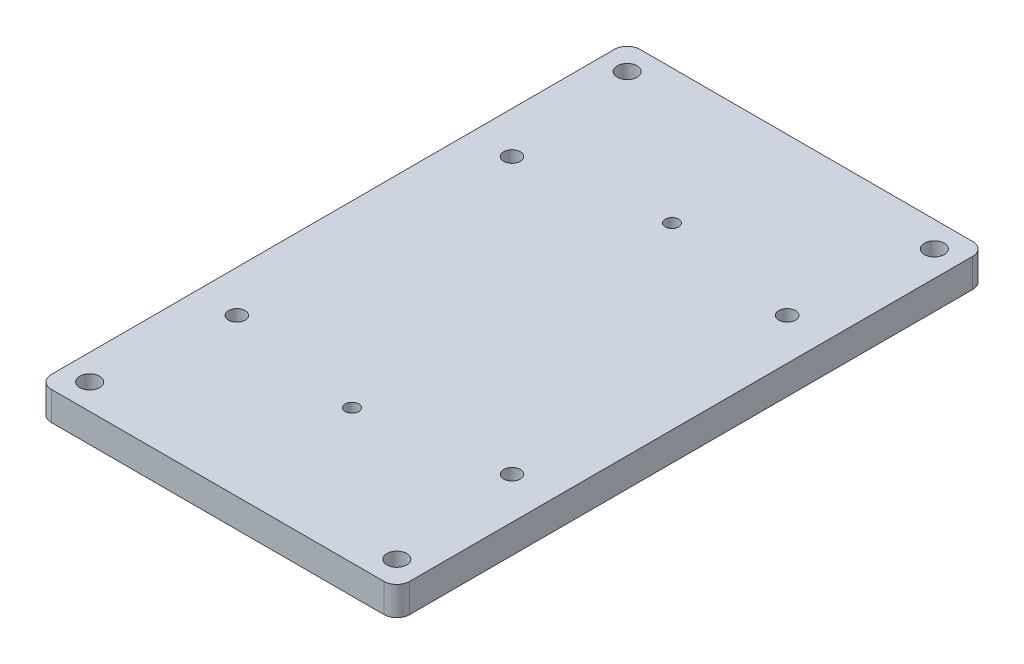
ISO-10303-21;
HEADER;
FILE_DESCRIPTION(('STEP AP214'),'2;1');
FILE_NAME('part.step','',(''),(''),'','','');
FILE_SCHEMA(('AUTOMOTIVE_DESIGN { 1 0 10303 214 1 1 1 1 }'));
ENDSEC;
DATA;
#1=APPLICATION_CONTEXT('core data for automotive mechanical design processes');
#2=APPLICATION_PROTOCOL_DEFINITION('international standard','automotive_design',2000,#1);
#3=PRODUCT_CONTEXT('',#1,'mechanical');
#4=PRODUCT('Part','Part','',(#3));
#5=PRODUCT_RELATED_PRODUCT_CATEGORY('part','',(#4));
#6=PRODUCT_DEFINITION_FORMATION('','',#4);
#7=PRODUCT_DEFINITION_CONTEXT('part definition',#1,'design');
#8=PRODUCT_DEFINITION('design','',#6,#7);
#9=PRODUCT_DEFINITION_SHAPE('','',#8);
#10=(LENGTH_UNIT() NAMED_UNIT(*) SI_UNIT(.MILLI.,.METRE.));
#11=(NAMED_UNIT(*) PLANE_ANGLE_UNIT() SI_UNIT($,.RADIAN.));
#12=(NAMED_UNIT(*) SI_UNIT($,.STERADIAN.) SOLID_ANGLE_UNIT());
#13=UNCERTAINTY_MEASURE_WITH_UNIT(LENGTH_MEASURE(1.E-05),#10,'distance_accuracy_value','');
#14=(GEOMETRIC_REPRESENTATION_CONTEXT(3) GLOBAL_UNCERTAINTY_ASSIGNED_CONTEXT((#13)) GLOBAL_UNIT_ASSIGNED_CONTEXT((#10,
#11,#12)) REPRESENTATION_CONTEXT('',''));
#15=CARTESIAN_POINT('',(0.,0.,0.));
#16=DIRECTION('',(0.,0.,1.));
#17=DIRECTION('',(1.,0.,0.));
#18=AXIS2_PLACEMENT_3D('',#15,#16,#17);
#19=CARTESIAN_POINT('',(26.,4.5,-44.));
#20=DIRECTION('',(0.,1.,0.));
#21=DIRECTION('',(0.,0.,1.));
#22=AXIS2_PLACEMENT_3D('',#19,#20,#21);
#23=PLANE('',#22);
#24=CARTESIAN_POINT('',(0.,4.5,-25.));
#25=DIRECTION('',(0.,1.,0.));
#26=DIRECTION('',(0.,0.,1.));
#27=AXIS2_PLACEMENT_3D('',#24,#25,#26);
#28=CIRCLE('',#27,1.05);
#29=CARTESIAN_POINT('',(0.,4.5,-23.95));
#30=VERTEX_POINT('',#29);
#31=EDGE_CURVE('E225',#30,#30,#28,.T.);
#32=ORIENTED_EDGE('',*,*,#31,.F.);
#33=EDGE_LOOP('',(#32));
#34=FACE_BOUND('',#33,.T.);
#35=CARTESIAN_POINT('',(21.5,4.5,21.5));
#36=DIRECTION('',(0.,1.,0.));
#37=DIRECTION('',(0.,0.,1.));
#38=AXIS2_PLACEMENT_3D('',#35,#36,#37);
#39=CIRCLE('',#38,1.3);
#40=CARTESIAN_POINT('',(21.5,4.5,22.8));
#41=VERTEX_POINT('',#40);
#42=EDGE_CURVE('E213',#41,#41,#39,.T.);
#43=ORIENTED_EDGE('',*,*,#42,.F.);
#44=EDGE_LOOP('',(#43));
#45=FACE_BOUND('',#44,.T.);
#46=CARTESIAN_POINT('',(-21.5,4.5,-21.5));
#47=DIRECTION('',(0.,1.,0.));
#48=DIRECTION('',(0.,0.,1.));
#49=AXIS2_PLACEMENT_3D('',#46,#47,#48);
#50=CIRCLE('',#49,1.3);
#51=CARTESIAN_POINT('',(-21.5,4.5,-20.2));
#52=VERTEX_POINT('',#51);
#53=EDGE_CURVE('E201',#52,#52,#50,.T.);
#54=ORIENTED_EDGE('',*,*,#53,.F.);
#55=EDGE_LOOP('',(#54));
#56=FACE_BOUND('',#55,.T.);
#57=CARTESIAN_POINT('',(-24.,4.5,-42.));
#58=DIRECTION('',(0.,1.,0.));
#59=DIRECTION('',(0.,0.,-1.));
#60=AXIS2_PLACEMENT_3D('',#57,#58,#59);
#61=CIRCLE('',#60,1.55);
#62=CARTESIAN_POINT('',(-24.,4.5,-43.55));
#63=VERTEX_POINT('',#62);
#64=EDGE_CURVE('E189',#63,#63,#61,.T.);
#65=ORIENTED_EDGE('',*,*,#64,.F.);
#66=EDGE_LOOP('',(#65));
#67=FACE_BOUND('',#66,.T.);
#68=CARTESIAN_POINT('',(24.,4.5,-42.));
#69=DIRECTION('',(0.,1.,0.));
#70=DIRECTION('',(0.,0.,1.));
#71=AXIS2_PLACEMENT_3D('',#68,#69,#70);
#72=CIRCLE('',#71,1.55);
#73=CARTESIAN_POINT('',(24.,4.5,-40.45));
#74=VERTEX_POINT('',#73);
#75=EDGE_CURVE('E135',#74,#74,#72,.T.);
#76=ORIENTED_EDGE('',*,*,#75,.F.);
#77=EDGE_LOOP('',(#76));
#78=FACE_BOUND('',#77,.T.);
#79=CARTESIAN_POINT('',(26.,4.5,-44.));
#80=DIRECTION('',(0.,1.,0.));
#81=DIRECTION('',(0.,0.,1.));
#82=AXIS2_PLACEMENT_3D('',#79,#80,#81);
#83=CIRCLE('',#82,1.99999999999999);
#84=CARTESIAN_POINT('',(28.,4.5,-44.));
#85=VERTEX_POINT('',#84);
#86=CARTESIAN_POINT('',(26.,4.5,-46.));
#87=VERTEX_POINT('',#86);
#88=EDGE_CURVE('E146',#85,#87,#83,.T.);
#89=ORIENTED_EDGE('',*,*,#88,.T.);
#90=DIRECTION('',(-1.,0.,0.));
#91=VECTOR('',#90,1.);
#92=CARTESIAN_POINT('',(-26.,4.5,-46.));
#93=LINE('',#92,#91);
#94=CARTESIAN_POINT('',(-26.,4.5,-46.));
#95=VERTEX_POINT('',#94);
#96=EDGE_CURVE('E94',#87,#95,#93,.T.);
#97=ORIENTED_EDGE('',*,*,#96,.T.);
#98=CARTESIAN_POINT('',(-26.,4.5,-44.));
#99=DIRECTION('',(0.,1.,0.));
#100=DIRECTION('',(0.,0.,-1.));
#101=AXIS2_PLACEMENT_3D('',#98,#99,#100);
#102=CIRCLE('',#101,1.99999999999999);
#103=CARTESIAN_POINT('',(-28.,4.5,-44.));
#104=VERTEX_POINT('',#103);
#105=EDGE_CURVE('E161',#95,#104,#102,.T.);
#106=ORIENTED_EDGE('',*,*,#105,.T.);
#107=DIRECTION('',(0.,0.,1.));
#108=VECTOR('',#107,1.);
#109=CARTESIAN_POINT('',(-28.,4.5,44.));
#110=LINE('',#109,#108);
#111=CARTESIAN_POINT('',(-28.,4.5,44.));
#112=VERTEX_POINT('',#111);
#113=EDGE_CURVE('E174',#104,#112,#110,.T.);
#114=ORIENTED_EDGE('',*,*,#113,.T.);
#115=CARTESIAN_POINT('',(-26.,4.5,44.));
#116=DIRECTION('',(0.,1.,0.));
#117=DIRECTION('',(0.,0.,1.));
#118=AXIS2_PLACEMENT_3D('',#115,#116,#117);
#119=CIRCLE('',#118,1.99999999999999);
#120=CARTESIAN_POINT('',(-26.,4.5,46.));
#121=VERTEX_POINT('',#120);
#122=EDGE_CURVE('E113',#112,#121,#119,.T.);
#123=ORIENTED_EDGE('',*,*,#122,.T.);
#124=DIRECTION('',(1.,0.,0.));
#125=VECTOR('',#124,1.);
#126=CARTESIAN_POINT('',(-26.,4.5,46.));
#127=LINE('',#126,#125);
#128=CARTESIAN_POINT('',(26.,4.5,46.));
#129=VERTEX_POINT('',#128);
#130=EDGE_CURVE('E107',#121,#129,#127,.T.);
#131=ORIENTED_EDGE('',*,*,#130,.T.);
#132=CARTESIAN_POINT('',(26.,4.5,44.));
#133=DIRECTION('',(0.,1.,0.));
#134=DIRECTION('',(0.,0.,1.));
#135=AXIS2_PLACEMENT_3D('',#132,#133,#134);
#136=CIRCLE('',#135,1.99999999999999);
#137=CARTESIAN_POINT('',(28.,4.5,44.));
#138=VERTEX_POINT('',#137);
#139=EDGE_CURVE('E111',#129,#138,#136,.T.);
#140=ORIENTED_EDGE('',*,*,#139,.T.);
#141=DIRECTION('',(0.,0.,-1.));
#142=VECTOR('',#141,1.);
#143=CARTESIAN_POINT('',(28.,4.5,44.));
#144=LINE('',#143,#142);
#145=EDGE_CURVE('E51',#138,#85,#144,.T.);
#146=ORIENTED_EDGE('',*,*,#145,.T.);
#147=EDGE_LOOP('',(#89,#97,#106,#114,#123,#131,#140,#146));
#148=FACE_BOUND('',#147,.T.);
#149=CARTESIAN_POINT('',(24.,4.5,42.));
#150=DIRECTION('',(0.,1.,0.));
#151=DIRECTION('',(0.,0.,-1.));
#152=AXIS2_PLACEMENT_3D('',#149,#150,#151);
#153=CIRCLE('',#152,1.55);
#154=CARTESIAN_POINT('',(24.,4.5,40.45));
#155=VERTEX_POINT('',#154);
#156=EDGE_CURVE('E183',#155,#155,#153,.T.);
#157=ORIENTED_EDGE('',*,*,#156,.F.);
#158=EDGE_LOOP('',(#157));
#159=FACE_BOUND('',#158,.T.);
#160=CARTESIAN_POINT('',(-24.,4.5,42.));
#161=DIRECTION('',(0.,1.,0.));
#162=DIRECTION('',(0.,0.,1.));
#163=AXIS2_PLACEMENT_3D('',#160,#161,#162);
#164=CIRCLE('',#163,1.55);
#165=CARTESIAN_POINT('',(-24.,4.5,43.55));
#166=VERTEX_POINT('',#165);
#167=EDGE_CURVE('E195',#166,#166,#164,.T.);
#168=ORIENTED_EDGE('',*,*,#167,.F.);
#169=EDGE_LOOP('',(#168));
#170=FACE_BOUND('',#169,.T.);
#171=CARTESIAN_POINT('',(21.5,4.5,-21.5));
#172=DIRECTION('',(0.,1.,0.));
#173=DIRECTION('',(0.,0.,-1.));
#174=AXIS2_PLACEMENT_3D('',#171,#172,#173);
#175=CIRCLE('',#174,1.3);
#176=CARTESIAN_POINT('',(21.5,4.5,-22.8));
#177=VERTEX_POINT('',#176);
#178=EDGE_CURVE('E207',#177,#177,#175,.T.);
#179=ORIENTED_EDGE('',*,*,#178,.F.);
#180=EDGE_LOOP('',(#179));
#181=FACE_BOUND('',#180,.T.);
#182=CARTESIAN_POINT('',(-21.5,4.5,21.5));
#183=DIRECTION('',(0.,1.,0.));
#184=DIRECTION('',(0.,0.,-1.));
#185=AXIS2_PLACEMENT_3D('',#182,#183,#184);
#186=CIRCLE('',#185,1.3);
#187=CARTESIAN_POINT('',(-21.5,4.5,20.2));
#188=VERTEX_POINT('',#187);
#189=EDGE_CURVE('E219',#188,#188,#186,.T.);
#190=ORIENTED_EDGE('',*,*,#189,.F.);
#191=EDGE_LOOP('',(#190));
#192=FACE_BOUND('',#191,.T.);
#193=CARTESIAN_POINT('',(0.,4.5,25.));
#194=DIRECTION('',(0.,1.,0.));
#195=DIRECTION('',(0.,0.,-1.));
#196=AXIS2_PLACEMENT_3D('',#193,#194,#195);
#197=CIRCLE('',#196,1.05);
#198=CARTESIAN_POINT('',(0.,4.5,23.95));
#199=VERTEX_POINT('',#198);
#200=EDGE_CURVE('E231',#199,#199,#197,.T.);
#201=ORIENTED_EDGE('',*,*,#200,.F.);
#202=EDGE_LOOP('',(#201));
#203=FACE_BOUND('',#202,.T.);
#204=ADVANCED_FACE('F34',(#34,#45,#56,#67,#78,#148,#159,#170,#181,#192,#203),#23,.T.);
#205=CARTESIAN_POINT('',(26.,0.,-44.));
#206=DIRECTION('',(0.,1.,0.));
#207=DIRECTION('',(0.,0.,1.));
#208=AXIS2_PLACEMENT_3D('',#205,#206,#207);
#209=PLANE('',#208);
#210=CARTESIAN_POINT('',(26.,0.,-44.));
#211=DIRECTION('',(0.,1.,0.));
#212=DIRECTION('',(0.,0.,1.));
#213=AXIS2_PLACEMENT_3D('',#210,#211,#212);
#214=CIRCLE('',#213,1.99999999999999);
#215=CARTESIAN_POINT('',(28.,0.,-44.));
#216=VERTEX_POINT('',#215);
#217=CARTESIAN_POINT('',(26.,0.,-46.));
#218=VERTEX_POINT('',#217);
#219=EDGE_CURVE('E131',#216,#218,#214,.T.);
#220=ORIENTED_EDGE('',*,*,#219,.F.);
#221=DIRECTION('',(0.,0.,-1.));
#222=VECTOR('',#221,1.);
#223=CARTESIAN_POINT('',(28.,0.,44.));
#224=LINE('',#223,#222);
#225=CARTESIAN_POINT('',(28.,0.,44.));
#226=VERTEX_POINT('',#225);
#227=EDGE_CURVE('E86',#226,#216,#224,.T.);
#228=ORIENTED_EDGE('',*,*,#227,.F.);
#229=CARTESIAN_POINT('',(26.,0.,44.));
#230=DIRECTION('',(0.,1.,0.));
#231=DIRECTION('',(0.,0.,1.));
#232=AXIS2_PLACEMENT_3D('',#229,#230,#231);
#233=CIRCLE('',#232,1.99999999999999);
#234=CARTESIAN_POINT('',(26.,0.,46.));
#235=VERTEX_POINT('',#234);
#236=EDGE_CURVE('E80',#235,#226,#233,.T.);
#237=ORIENTED_EDGE('',*,*,#236,.F.);
#238=DIRECTION('',(1.,0.,0.));
#239=VECTOR('',#238,1.);
#240=CARTESIAN_POINT('',(-26.,0.,46.));
#241=LINE('',#240,#239);
#242=CARTESIAN_POINT('',(-26.,0.,46.));
#243=VERTEX_POINT('',#242);
#244=EDGE_CURVE('E121',#243,#235,#241,.T.);
#245=ORIENTED_EDGE('',*,*,#244,.F.);
#246=CARTESIAN_POINT('',(-26.,0.,44.));
#247=DIRECTION('',(0.,1.,0.));
#248=DIRECTION('',(0.,0.,1.));
#249=AXIS2_PLACEMENT_3D('',#246,#247,#248);
#250=CIRCLE('',#249,1.99999999999999);
#251=CARTESIAN_POINT('',(-28.,0.,44.));
#252=VERTEX_POINT('',#251);
#253=EDGE_CURVE('E141',#252,#243,#250,.T.);
#254=ORIENTED_EDGE('',*,*,#253,.F.);
#255=DIRECTION('',(0.,0.,1.));
#256=VECTOR('',#255,1.);
#257=CARTESIAN_POINT('',(-28.,0.,44.));
#258=LINE('',#257,#256);
#259=CARTESIAN_POINT('',(-28.,0.,-44.));
#260=VERTEX_POINT('',#259);
#261=EDGE_CURVE('E139',#260,#252,#258,.T.);
#262=ORIENTED_EDGE('',*,*,#261,.F.);
#263=CARTESIAN_POINT('',(-26.,0.,-44.));
#264=DIRECTION('',(0.,1.,0.));
#265=DIRECTION('',(0.,0.,-1.));
#266=AXIS2_PLACEMENT_3D('',#263,#264,#265);
#267=CIRCLE('',#266,1.99999999999999);
#268=CARTESIAN_POINT('',(-26.,0.,-46.));
#269=VERTEX_POINT('',#268);
#270=EDGE_CURVE('E137',#269,#260,#267,.T.);
#271=ORIENTED_EDGE('',*,*,#270,.F.);
#272=DIRECTION('',(-1.,0.,0.));
#273=VECTOR('',#272,1.);
#274=CARTESIAN_POINT('',(-26.,0.,-46.));
#275=LINE('',#274,#273);
#276=EDGE_CURVE('E134',#218,#269,#275,.T.);
#277=ORIENTED_EDGE('',*,*,#276,.F.);
#278=EDGE_LOOP('',(#220,#228,#237,#245,#254,#262,#271,#277));
#279=FACE_BOUND('',#278,.T.);
#280=CARTESIAN_POINT('',(24.,0.,-42.));
#281=DIRECTION('',(0.,1.,0.));
#282=DIRECTION('',(0.,0.,1.));
#283=AXIS2_PLACEMENT_3D('',#280,#281,#282);
#284=CIRCLE('',#283,1.55);
#285=CARTESIAN_POINT('',(24.,0.,-40.45));
#286=VERTEX_POINT('',#285);
#287=EDGE_CURVE('E180',#286,#286,#284,.T.);
#288=ORIENTED_EDGE('',*,*,#287,.T.);
#289=EDGE_LOOP('',(#288));
#290=FACE_BOUND('',#289,.T.);
#291=CARTESIAN_POINT('',(24.,0.,42.));
#292=DIRECTION('',(0.,1.,0.));
#293=DIRECTION('',(0.,0.,-1.));
#294=AXIS2_PLACEMENT_3D('',#291,#292,#293);
#295=CIRCLE('',#294,1.55);
#296=CARTESIAN_POINT('',(24.,0.,40.45));
#297=VERTEX_POINT('',#296);
#298=EDGE_CURVE('E186',#297,#297,#295,.T.);
#299=ORIENTED_EDGE('',*,*,#298,.T.);
#300=EDGE_LOOP('',(#299));
#301=FACE_BOUND('',#300,.T.);
#302=CARTESIAN_POINT('',(-24.,0.,-42.));
#303=DIRECTION('',(0.,1.,0.));
#304=DIRECTION('',(0.,0.,-1.));
#305=AXIS2_PLACEMENT_3D('',#302,#303,#304);
#306=CIRCLE('',#305,1.55);
#307=CARTESIAN_POINT('',(-24.,0.,-43.55));
#308=VERTEX_POINT('',#307);
#309=EDGE_CURVE('E192',#308,#308,#306,.T.);
#310=ORIENTED_EDGE('',*,*,#309,.T.);
#311=EDGE_LOOP('',(#310));
#312=FACE_BOUND('',#311,.T.);
#313=CARTESIAN_POINT('',(-24.,0.,42.));
#314=DIRECTION('',(0.,1.,0.));
#315=DIRECTION('',(0.,0.,1.));
#316=AXIS2_PLACEMENT_3D('',#313,#314,#315);
#317=CIRCLE('',#316,1.55);
#318=CARTESIAN_POINT('',(-24.,0.,43.55));
#319=VERTEX_POINT('',#318);
#320=EDGE_CURVE('E198',#319,#319,#317,.T.);
#321=ORIENTED_EDGE('',*,*,#320,.T.);
#322=EDGE_LOOP('',(#321));
#323=FACE_BOUND('',#322,.T.);
#324=CARTESIAN_POINT('',(-21.5,0.,-21.5));
#325=DIRECTION('',(0.,1.,0.));
#326=DIRECTION('',(0.,0.,1.));
#327=AXIS2_PLACEMENT_3D('',#324,#325,#326);
#328=CIRCLE('',#327,1.3);
#329=CARTESIAN_POINT('',(-21.5,0.,-20.2));
#330=VERTEX_POINT('',#329);
#331=EDGE_CURVE('E204',#330,#330,#328,.T.);
#332=ORIENTED_EDGE('',*,*,#331,.T.);
#333=EDGE_LOOP('',(#332));
#334=FACE_BOUND('',#333,.T.);
#335=CARTESIAN_POINT('',(21.5,0.,-21.5));
#336=DIRECTION('',(0.,1.,0.));
#337=DIRECTION('',(0.,0.,-1.));
#338=AXIS2_PLACEMENT_3D('',#335,#336,#337);
#339=CIRCLE('',#338,1.3);
#340=CARTESIAN_POINT('',(21.5,0.,-22.8));
#341=VERTEX_POINT('',#340);
#342=EDGE_CURVE('E210',#341,#341,#339,.T.);
#343=ORIENTED_EDGE('',*,*,#342,.T.);
#344=EDGE_LOOP('',(#343));
#345=FACE_BOUND('',#344,.T.);
#346=CARTESIAN_POINT('',(21.5,0.,21.5));
#347=DIRECTION('',(0.,1.,0.));
#348=DIRECTION('',(0.,0.,1.));
#349=AXIS2_PLACEMENT_3D('',#346,#347,#348);
#350=CIRCLE('',#349,1.3);
#351=CARTESIAN_POINT('',(21.5,0.,22.8));
#352=VERTEX_POINT('',#351);
#353=EDGE_CURVE('E216',#352,#352,#350,.T.);
#354=ORIENTED_EDGE('',*,*,#353,.T.);
#355=EDGE_LOOP('',(#354));
#356=FACE_BOUND('',#355,.T.);
#357=CARTESIAN_POINT('',(-21.5,0.,21.5));
#358=DIRECTION('',(0.,1.,0.));
#359=DIRECTION('',(0.,0.,-1.));
#360=AXIS2_PLACEMENT_3D('',#357,#358,#359);
#361=CIRCLE('',#360,1.3);
#362=CARTESIAN_POINT('',(-21.5,0.,20.2));
#363=VERTEX_POINT('',#362);
#364=EDGE_CURVE('E222',#363,#363,#361,.T.);
#365=ORIENTED_EDGE('',*,*,#364,.T.);
#366=EDGE_LOOP('',(#365));
#367=FACE_BOUND('',#366,.T.);
#368=CARTESIAN_POINT('',(0.,0.,-25.));
#369=DIRECTION('',(0.,1.,0.));
#370=DIRECTION('',(0.,0.,1.));
#371=AXIS2_PLACEMENT_3D('',#368,#369,#370);
#372=CIRCLE('',#371,1.05);
#373=CARTESIAN_POINT('',(0.,0.,-23.95));
#374=VERTEX_POINT('',#373);
#375=EDGE_CURVE('E228',#374,#374,#372,.T.);
#376=ORIENTED_EDGE('',*,*,#375,.T.);
#377=EDGE_LOOP('',(#376));
#378=FACE_BOUND('',#377,.T.);
#379=CARTESIAN_POINT('',(0.,0.,25.));
#380=DIRECTION('',(0.,1.,0.));
#381=DIRECTION('',(0.,0.,-1.));
#382=AXIS2_PLACEMENT_3D('',#379,#380,#381);
#383=CIRCLE('',#382,1.05);
#384=CARTESIAN_POINT('',(0.,0.,23.95));
#385=VERTEX_POINT('',#384);
#386=EDGE_CURVE('E234',#385,#385,#383,.T.);
#387=ORIENTED_EDGE('',*,*,#386,.T.);
#388=EDGE_LOOP('',(#387));
#389=FACE_BOUND('',#388,.T.);
#390=ADVANCED_FACE('F165',(#279,#290,#301,#312,#323,#334,#345,#356,#367,#378,#389),#209,.F.);
#391=CARTESIAN_POINT('',(26.,4.5,-44.));
#392=DIRECTION('',(0.,-1.,0.));
#393=DIRECTION('',(0.,0.,-1.));
#394=AXIS2_PLACEMENT_3D('',#391,#392,#393);
#395=CYLINDRICAL_SURFACE('',#394,1.99999999999999);
#396=ORIENTED_EDGE('',*,*,#219,.T.);
#397=DIRECTION('',(0.,-1.,0.));
#398=VECTOR('',#397,1.);
#399=CARTESIAN_POINT('',(26.,4.5,-46.));
#400=LINE('',#399,#398);
#401=EDGE_CURVE('E11',#87,#218,#400,.T.);
#402=ORIENTED_EDGE('',*,*,#401,.F.);
#403=ORIENTED_EDGE('',*,*,#88,.F.);
#404=DIRECTION('',(0.,-1.,0.));
#405=VECTOR('',#404,1.);
#406=CARTESIAN_POINT('',(28.,4.5,-44.));
#407=LINE('',#406,#405);
#408=EDGE_CURVE('E127',#85,#216,#407,.T.);
#409=ORIENTED_EDGE('',*,*,#408,.T.);
#410=EDGE_LOOP('',(#396,#402,#403,#409));
#411=FACE_BOUND('',#410,.T.);
#412=ADVANCED_FACE('F36',(#411),#395,.T.);
#413=CARTESIAN_POINT('',(-26.,4.5,-46.));
#414=DIRECTION('',(0.,0.,1.));
#415=DIRECTION('',(1.,0.,0.));
#416=AXIS2_PLACEMENT_3D('',#413,#414,#415);
#417=PLANE('',#416);
#418=ORIENTED_EDGE('',*,*,#276,.T.);
#419=DIRECTION('',(0.,-1.,0.));
#420=VECTOR('',#419,1.);
#421=CARTESIAN_POINT('',(-26.,4.5,-46.));
#422=LINE('',#421,#420);
#423=EDGE_CURVE('E43',#95,#269,#422,.T.);
#424=ORIENTED_EDGE('',*,*,#423,.F.);
#425=ORIENTED_EDGE('',*,*,#96,.F.);
#426=ORIENTED_EDGE('',*,*,#401,.T.);
#427=EDGE_LOOP('',(#418,#424,#425,#426));
#428=FACE_BOUND('',#427,.T.);
#429=ADVANCED_FACE('F268',(#428),#417,.F.);
#430=CARTESIAN_POINT('',(-26.,4.5,-44.));
#431=DIRECTION('',(0.,-1.,0.));
#432=DIRECTION('',(0.,0.,-1.));
#433=AXIS2_PLACEMENT_3D('',#430,#431,#432);
#434=CYLINDRICAL_SURFACE('',#433,1.99999999999999);
#435=ORIENTED_EDGE('',*,*,#270,.T.);
#436=DIRECTION('',(0.,-1.,0.));
#437=VECTOR('',#436,1.);
#438=CARTESIAN_POINT('',(-28.,4.5,-44.));
#439=LINE('',#438,#437);
#440=EDGE_CURVE('E153',#104,#260,#439,.T.);
#441=ORIENTED_EDGE('',*,*,#440,.F.);
#442=ORIENTED_EDGE('',*,*,#105,.F.);
#443=ORIENTED_EDGE('',*,*,#423,.T.);
#444=EDGE_LOOP('',(#435,#441,#442,#443));
#445=FACE_BOUND('',#444,.T.);
#446=ADVANCED_FACE('F159',(#445),#434,.T.);
#447=CARTESIAN_POINT('',(-28.,4.5,44.));
#448=DIRECTION('',(1.,0.,0.));
#449=DIRECTION('',(0.,0.,-1.));
#450=AXIS2_PLACEMENT_3D('',#447,#448,#449);
#451=PLANE('',#450);
#452=ORIENTED_EDGE('',*,*,#261,.T.);
#453=DIRECTION('',(0.,-1.,0.));
#454=VECTOR('',#453,1.);
#455=CARTESIAN_POINT('',(-28.,4.5,44.));
#456=LINE('',#455,#454);
#457=EDGE_CURVE('E150',#112,#252,#456,.T.);
#458=ORIENTED_EDGE('',*,*,#457,.F.);
#459=ORIENTED_EDGE('',*,*,#113,.F.);
#460=ORIENTED_EDGE('',*,*,#440,.T.);
#461=EDGE_LOOP('',(#452,#458,#459,#460));
#462=FACE_BOUND('',#461,.T.);
#463=ADVANCED_FACE('F170',(#462),#451,.F.);
#464=CARTESIAN_POINT('',(-26.,4.5,44.));
#465=DIRECTION('',(0.,-1.,0.));
#466=DIRECTION('',(0.,0.,-1.));
#467=AXIS2_PLACEMENT_3D('',#464,#465,#466);
#468=CYLINDRICAL_SURFACE('',#467,1.99999999999999);
#469=ORIENTED_EDGE('',*,*,#253,.T.);
#470=DIRECTION('',(0.,-1.,0.));
#471=VECTOR('',#470,1.);
#472=CARTESIAN_POINT('',(-26.,4.5,46.));
#473=LINE('',#472,#471);
#474=EDGE_CURVE('E122',#121,#243,#473,.T.);
#475=ORIENTED_EDGE('',*,*,#474,.F.);
#476=ORIENTED_EDGE('',*,*,#122,.F.);
#477=ORIENTED_EDGE('',*,*,#457,.T.);
#478=EDGE_LOOP('',(#469,#475,#476,#477));
#479=FACE_BOUND('',#478,.T.);
#480=ADVANCED_FACE('F173',(#479),#468,.T.);
#481=CARTESIAN_POINT('',(-26.,4.5,46.));
#482=DIRECTION('',(0.,0.,-1.));
#483=DIRECTION('',(-1.,0.,0.));
#484=AXIS2_PLACEMENT_3D('',#481,#482,#483);
#485=PLANE('',#484);
#486=ORIENTED_EDGE('',*,*,#244,.T.);
#487=DIRECTION('',(0.,-1.,0.));
#488=VECTOR('',#487,1.);
#489=CARTESIAN_POINT('',(26.,4.5,46.));
#490=LINE('',#489,#488);
#491=EDGE_CURVE('E118',#129,#235,#490,.T.);
#492=ORIENTED_EDGE('',*,*,#491,.F.);
#493=ORIENTED_EDGE('',*,*,#130,.F.);
#494=ORIENTED_EDGE('',*,*,#474,.T.);
#495=EDGE_LOOP('',(#486,#492,#493,#494));
#496=FACE_BOUND('',#495,.T.);
#497=ADVANCED_FACE('F119',(#496),#485,.F.);
#498=CARTESIAN_POINT('',(26.,4.5,44.));
#499=DIRECTION('',(0.,-1.,0.));
#500=DIRECTION('',(0.,0.,-1.));
#501=AXIS2_PLACEMENT_3D('',#498,#499,#500);
#502=CYLINDRICAL_SURFACE('',#501,1.99999999999999);
#503=ORIENTED_EDGE('',*,*,#236,.T.);
#504=DIRECTION('',(0.,-1.,0.));
#505=VECTOR('',#504,1.);
#506=CARTESIAN_POINT('',(28.,4.5,44.));
#507=LINE('',#506,#505);
#508=EDGE_CURVE('E123',#138,#226,#507,.T.);
#509=ORIENTED_EDGE('',*,*,#508,.F.);
#510=ORIENTED_EDGE('',*,*,#139,.F.);
#511=ORIENTED_EDGE('',*,*,#491,.T.);
#512=EDGE_LOOP('',(#503,#509,#510,#511));
#513=FACE_BOUND('',#512,.T.);
#514=ADVANCED_FACE('F125',(#513),#502,.T.);
#515=CARTESIAN_POINT('',(28.,4.5,44.));
#516=DIRECTION('',(-1.,0.,0.));
#517=DIRECTION('',(0.,0.,1.));
#518=AXIS2_PLACEMENT_3D('',#515,#516,#517);
#519=PLANE('',#518);
#520=ORIENTED_EDGE('',*,*,#227,.T.);
#521=ORIENTED_EDGE('',*,*,#408,.F.);
#522=ORIENTED_EDGE('',*,*,#145,.F.);
#523=ORIENTED_EDGE('',*,*,#508,.T.);
#524=EDGE_LOOP('',(#520,#521,#522,#523));
#525=FACE_BOUND('',#524,.T.);
#526=ADVANCED_FACE('F256',(#525),#519,.F.);
#527=CARTESIAN_POINT('',(24.,4.5,-42.));
#528=DIRECTION('',(0.,-1.,0.));
#529=DIRECTION('',(0.,0.,-1.));
#530=AXIS2_PLACEMENT_3D('',#527,#528,#529);
#531=CYLINDRICAL_SURFACE('',#530,1.55);
#532=ORIENTED_EDGE('',*,*,#75,.T.);
#533=EDGE_LOOP('',(#532));
#534=FACE_BOUND('',#533,.T.);
#535=ORIENTED_EDGE('',*,*,#287,.F.);
#536=EDGE_LOOP('',(#535));
#537=FACE_BOUND('',#536,.T.);
#538=ADVANCED_FACE('F253',(#534,#537),#531,.F.);
#539=CARTESIAN_POINT('',(24.,4.5,42.));
#540=DIRECTION('',(0.,-1.,0.));
#541=DIRECTION('',(0.,0.,-1.));
#542=AXIS2_PLACEMENT_3D('',#539,#540,#541);
#543=CYLINDRICAL_SURFACE('',#542,1.55);
#544=ORIENTED_EDGE('',*,*,#156,.T.);
#545=EDGE_LOOP('',(#544));
#546=FACE_BOUND('',#545,.T.);
#547=ORIENTED_EDGE('',*,*,#298,.F.);
#548=EDGE_LOOP('',(#547));
#549=FACE_BOUND('',#548,.T.);
#550=ADVANCED_FACE('F332',(#546,#549),#543,.F.);
#551=CARTESIAN_POINT('',(-24.,4.5,-42.));
#552=DIRECTION('',(0.,-1.,0.));
#553=DIRECTION('',(0.,0.,-1.));
#554=AXIS2_PLACEMENT_3D('',#551,#552,#553);
#555=CYLINDRICAL_SURFACE('',#554,1.55);
#556=ORIENTED_EDGE('',*,*,#64,.T.);
#557=EDGE_LOOP('',(#556));
#558=FACE_BOUND('',#557,.T.);
#559=ORIENTED_EDGE('',*,*,#309,.F.);
#560=EDGE_LOOP('',(#559));
#561=FACE_BOUND('',#560,.T.);
#562=ADVANCED_FACE('F340',(#558,#561),#555,.F.);
#563=CARTESIAN_POINT('',(-24.,4.5,42.));
#564=DIRECTION('',(0.,-1.,0.));
#565=DIRECTION('',(0.,0.,-1.));
#566=AXIS2_PLACEMENT_3D('',#563,#564,#565);
#567=CYLINDRICAL_SURFACE('',#566,1.55);
#568=ORIENTED_EDGE('',*,*,#167,.T.);
#569=EDGE_LOOP('',(#568));
#570=FACE_BOUND('',#569,.T.);
#571=ORIENTED_EDGE('',*,*,#320,.F.);
#572=EDGE_LOOP('',(#571));
#573=FACE_BOUND('',#572,.T.);
#574=ADVANCED_FACE('F348',(#570,#573),#567,.F.);
#575=CARTESIAN_POINT('',(-21.5,4.5,-21.5));
#576=DIRECTION('',(0.,-1.,0.));
#577=DIRECTION('',(0.,0.,-1.));
#578=AXIS2_PLACEMENT_3D('',#575,#576,#577);
#579=CYLINDRICAL_SURFACE('',#578,1.3);
#580=ORIENTED_EDGE('',*,*,#53,.T.);
#581=EDGE_LOOP('',(#580));
#582=FACE_BOUND('',#581,.T.);
#583=ORIENTED_EDGE('',*,*,#331,.F.);
#584=EDGE_LOOP('',(#583));
#585=FACE_BOUND('',#584,.T.);
#586=ADVANCED_FACE('F357',(#582,#585),#579,.F.);
#587=CARTESIAN_POINT('',(21.5,4.5,-21.5));
#588=DIRECTION('',(0.,-1.,0.));
#589=DIRECTION('',(0.,0.,-1.));
#590=AXIS2_PLACEMENT_3D('',#587,#588,#589);
#591=CYLINDRICAL_SURFACE('',#590,1.3);
#592=ORIENTED_EDGE('',*,*,#178,.T.);
#593=EDGE_LOOP('',(#592));
#594=FACE_BOUND('',#593,.T.);
#595=ORIENTED_EDGE('',*,*,#342,.F.);
#596=EDGE_LOOP('',(#595));
#597=FACE_BOUND('',#596,.T.);
#598=ADVANCED_FACE('F366',(#594,#597),#591,.F.);
#599=CARTESIAN_POINT('',(21.5,4.5,21.5));
#600=DIRECTION('',(0.,-1.,0.));
#601=DIRECTION('',(0.,0.,-1.));
#602=AXIS2_PLACEMENT_3D('',#599,#600,#601);
#603=CYLINDRICAL_SURFACE('',#602,1.3);
#604=ORIENTED_EDGE('',*,*,#42,.T.);
#605=EDGE_LOOP('',(#604));
#606=FACE_BOUND('',#605,.T.);
#607=ORIENTED_EDGE('',*,*,#353,.F.);
#608=EDGE_LOOP('',(#607));
#609=FACE_BOUND('',#608,.T.);
#610=ADVANCED_FACE('F375',(#606,#609),#603,.F.);
#611=CARTESIAN_POINT('',(-21.5,4.5,21.5));
#612=DIRECTION('',(0.,-1.,0.));
#613=DIRECTION('',(0.,0.,-1.));
#614=AXIS2_PLACEMENT_3D('',#611,#612,#613);
#615=CYLINDRICAL_SURFACE('',#614,1.3);
#616=ORIENTED_EDGE('',*,*,#189,.T.);
#617=EDGE_LOOP('',(#616));
#618=FACE_BOUND('',#617,.T.);
#619=ORIENTED_EDGE('',*,*,#364,.F.);
#620=EDGE_LOOP('',(#619));
#621=FACE_BOUND('',#620,.T.);
#622=ADVANCED_FACE('F384',(#618,#621),#615,.F.);
#623=CARTESIAN_POINT('',(0.,4.5,-25.));
#624=DIRECTION('',(0.,-1.,0.));
#625=DIRECTION('',(0.,0.,-1.));
#626=AXIS2_PLACEMENT_3D('',#623,#624,#625);
#627=CYLINDRICAL_SURFACE('',#626,1.05);
#628=ORIENTED_EDGE('',*,*,#31,.T.);
#629=EDGE_LOOP('',(#628));
#630=FACE_BOUND('',#629,.T.);
#631=ORIENTED_EDGE('',*,*,#375,.F.);
#632=EDGE_LOOP('',(#631));
#633=FACE_BOUND('',#632,.T.);
#634=ADVANCED_FACE('F393',(#630,#633),#627,.F.);
#635=CARTESIAN_POINT('',(0.,4.5,25.));
#636=DIRECTION('',(0.,-1.,0.));
#637=DIRECTION('',(0.,0.,-1.));
#638=AXIS2_PLACEMENT_3D('',#635,#636,#637);
#639=CYLINDRICAL_SURFACE('',#638,1.05);
#640=ORIENTED_EDGE('',*,*,#200,.T.);
#641=EDGE_LOOP('',(#640));
#642=FACE_BOUND('',#641,.T.);
#643=ORIENTED_EDGE('',*,*,#386,.F.);
#644=EDGE_LOOP('',(#643));
#645=FACE_BOUND('',#644,.T.);
#646=ADVANCED_FACE('F240',(#642,#645),#639,.F.);
#647=CLOSED_SHELL('',(#204,#390,#412,#429,#446,#463,#480,#497,#514,#526,#538,#550,#562,#574,
#586,#598,#610,#622,#634,#646));
#648=MANIFOLD_SOLID_BREP('B2',#647);
#649=ADVANCED_BREP_SHAPE_REPRESENTATION('',(#18,#648),#14);
#650=SHAPE_DEFINITION_REPRESENTATION(#9,#649);
ENDSEC;
END-ISO-10303-21;
